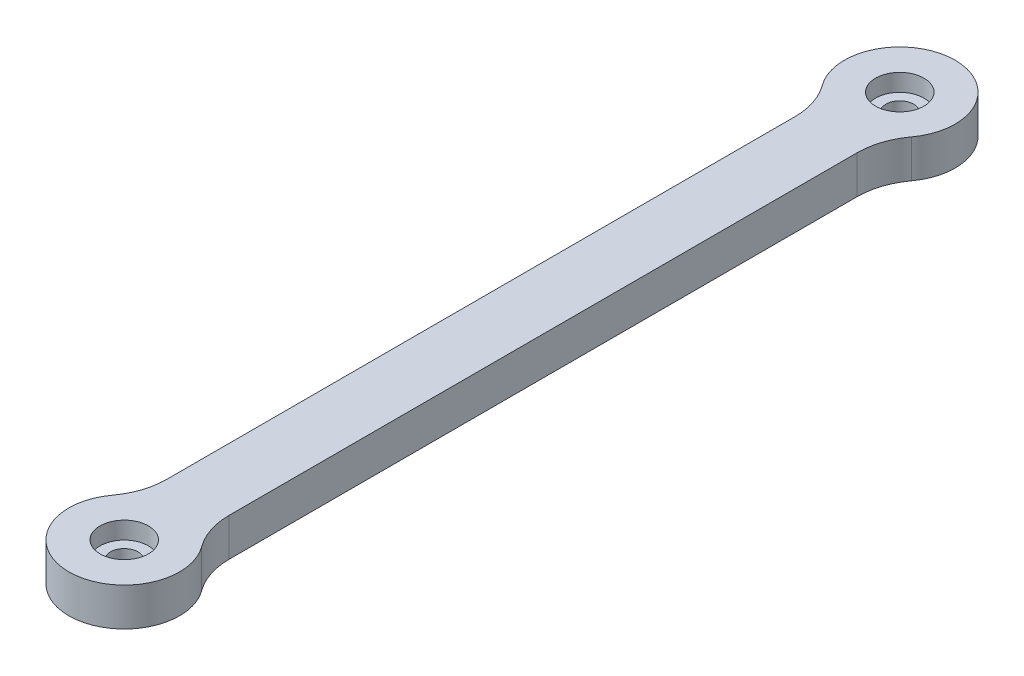
ISO-10303-21;
HEADER;
FILE_DESCRIPTION(('STEP AP214'),'2;1');
FILE_NAME('part.step','',(''),(''),'','','');
FILE_SCHEMA(('AUTOMOTIVE_DESIGN { 1 0 10303 214 1 1 1 1 }'));
ENDSEC;
DATA;
#1=APPLICATION_CONTEXT('core data for automotive mechanical design processes');
#2=APPLICATION_PROTOCOL_DEFINITION('international standard','automotive_design',2000,#1);
#3=PRODUCT_CONTEXT('',#1,'mechanical');
#4=PRODUCT('Part','Part','',(#3));
#5=PRODUCT_RELATED_PRODUCT_CATEGORY('part','',(#4));
#6=PRODUCT_DEFINITION_FORMATION('','',#4);
#7=PRODUCT_DEFINITION_CONTEXT('part definition',#1,'design');
#8=PRODUCT_DEFINITION('design','',#6,#7);
#9=PRODUCT_DEFINITION_SHAPE('','',#8);
#10=(LENGTH_UNIT() NAMED_UNIT(*) SI_UNIT(.MILLI.,.METRE.));
#11=(NAMED_UNIT(*) PLANE_ANGLE_UNIT() SI_UNIT($,.RADIAN.));
#12=(NAMED_UNIT(*) SI_UNIT($,.STERADIAN.) SOLID_ANGLE_UNIT());
#13=UNCERTAINTY_MEASURE_WITH_UNIT(LENGTH_MEASURE(1.E-05),#10,'distance_accuracy_value','');
#14=(GEOMETRIC_REPRESENTATION_CONTEXT(3) GLOBAL_UNCERTAINTY_ASSIGNED_CONTEXT((#13)) GLOBAL_UNIT_ASSIGNED_CONTEXT((#10,
#11,#12)) REPRESENTATION_CONTEXT('',''));
#15=CARTESIAN_POINT('',(0.,0.,0.));
#16=DIRECTION('',(0.,0.,1.));
#17=DIRECTION('',(1.,0.,0.));
#18=AXIS2_PLACEMENT_3D('',#15,#16,#17);
#19=CARTESIAN_POINT('',(0.,5.5,-56.));
#20=DIRECTION('',(0.,-1.,0.));
#21=DIRECTION('',(0.,0.,-1.));
#22=AXIS2_PLACEMENT_3D('',#19,#20,#21);
#23=CYLINDRICAL_SURFACE('',#22,2.);
#24=CARTESIAN_POINT('',(0.,0.,-56.));
#25=DIRECTION('',(0.,1.,0.));
#26=DIRECTION('',(0.,0.,1.));
#27=AXIS2_PLACEMENT_3D('',#24,#25,#26);
#28=CIRCLE('',#27,2.);
#29=CARTESIAN_POINT('',(0.,0.,-54.));
#30=VERTEX_POINT('',#29);
#31=EDGE_CURVE('E146',#30,#30,#28,.T.);
#32=ORIENTED_EDGE('',*,*,#31,.F.);
#33=EDGE_LOOP('',(#32));
#34=FACE_BOUND('',#33,.T.);
#35=CARTESIAN_POINT('',(0.,3.,-56.));
#36=DIRECTION('',(0.,1.,0.));
#37=DIRECTION('',(0.,0.,1.));
#38=AXIS2_PLACEMENT_3D('',#35,#36,#37);
#39=CIRCLE('',#38,2.);
#40=CARTESIAN_POINT('',(0.,3.,-54.));
#41=VERTEX_POINT('',#40);
#42=EDGE_CURVE('E226',#41,#41,#39,.T.);
#43=ORIENTED_EDGE('',*,*,#42,.T.);
#44=EDGE_LOOP('',(#43));
#45=FACE_BOUND('',#44,.T.);
#46=ADVANCED_FACE('F39',(#34,#45),#23,.F.);
#47=CARTESIAN_POINT('',(0.,5.5,56.));
#48=DIRECTION('',(0.,-1.,0.));
#49=DIRECTION('',(0.,0.,-1.));
#50=AXIS2_PLACEMENT_3D('',#47,#48,#49);
#51=CYLINDRICAL_SURFACE('',#50,2.);
#52=CARTESIAN_POINT('',(0.,0.,56.));
#53=DIRECTION('',(0.,1.,0.));
#54=DIRECTION('',(0.,0.,-1.));
#55=AXIS2_PLACEMENT_3D('',#52,#53,#54);
#56=CIRCLE('',#55,2.);
#57=CARTESIAN_POINT('',(0.,0.,54.));
#58=VERTEX_POINT('',#57);
#59=EDGE_CURVE('E212',#58,#58,#56,.T.);
#60=ORIENTED_EDGE('',*,*,#59,.F.);
#61=EDGE_LOOP('',(#60));
#62=FACE_BOUND('',#61,.T.);
#63=CARTESIAN_POINT('',(0.,3.,56.));
#64=DIRECTION('',(0.,1.,0.));
#65=DIRECTION('',(0.,0.,1.));
#66=AXIS2_PLACEMENT_3D('',#63,#64,#65);
#67=CIRCLE('',#66,2.);
#68=CARTESIAN_POINT('',(0.,3.,58.));
#69=VERTEX_POINT('',#68);
#70=EDGE_CURVE('E222',#69,#69,#67,.T.);
#71=ORIENTED_EDGE('',*,*,#70,.T.);
#72=EDGE_LOOP('',(#71));
#73=FACE_BOUND('',#72,.T.);
#74=ADVANCED_FACE('F257',(#62,#73),#51,.F.);
#75=CARTESIAN_POINT('',(14.5,5.5,-45.3346354961492));
#76=DIRECTION('',(0.,1.,0.));
#77=DIRECTION('',(0.,0.,1.));
#78=AXIS2_PLACEMENT_3D('',#75,#76,#77);
#79=PLANE('',#78);
#80=CARTESIAN_POINT('',(0.,5.5,-56.));
#81=DIRECTION('',(0.,1.,0.));
#82=DIRECTION('',(0.,0.,1.));
#83=AXIS2_PLACEMENT_3D('',#80,#81,#82);
#84=CIRCLE('',#83,3.5);
#85=CARTESIAN_POINT('',(0.,5.5,-52.5));
#86=VERTEX_POINT('',#85);
#87=EDGE_CURVE('E230',#86,#86,#84,.T.);
#88=ORIENTED_EDGE('',*,*,#87,.F.);
#89=EDGE_LOOP('',(#88));
#90=FACE_BOUND('',#89,.T.);
#91=CARTESIAN_POINT('',(0.,5.5,56.));
#92=DIRECTION('',(0.,1.,0.));
#93=DIRECTION('',(0.,0.,1.));
#94=AXIS2_PLACEMENT_3D('',#91,#92,#93);
#95=CIRCLE('',#94,3.5);
#96=CARTESIAN_POINT('',(0.,5.5,59.5));
#97=VERTEX_POINT('',#96);
#98=EDGE_CURVE('E217',#97,#97,#95,.T.);
#99=ORIENTED_EDGE('',*,*,#98,.F.);
#100=EDGE_LOOP('',(#99));
#101=FACE_BOUND('',#100,.T.);
#102=CARTESIAN_POINT('',(14.5,5.5,-45.3346354961492));
#103=DIRECTION('',(0.,-1.,0.));
#104=DIRECTION('',(0.,0.,1.));
#105=AXIS2_PLACEMENT_3D('',#102,#103,#104);
#106=CIRCLE('',#105,10.);
#107=CARTESIAN_POINT('',(4.5,5.5,-45.3346354961492));
#108=VERTEX_POINT('',#107);
#109=CARTESIAN_POINT('',(6.44444444444444,5.5,-51.2598379982886));
#110=VERTEX_POINT('',#109);
#111=EDGE_CURVE('E164',#108,#110,#106,.T.);
#112=ORIENTED_EDGE('',*,*,#111,.T.);
#113=CARTESIAN_POINT('',(0.,5.5,-56.));
#114=DIRECTION('',(0.,1.,0.));
#115=DIRECTION('',(0.,0.,1.));
#116=AXIS2_PLACEMENT_3D('',#113,#114,#115);
#117=CIRCLE('',#116,8.);
#118=CARTESIAN_POINT('',(-6.44444444444444,5.5,-51.2598379982886));
#119=VERTEX_POINT('',#118);
#120=EDGE_CURVE('E100',#110,#119,#117,.T.);
#121=ORIENTED_EDGE('',*,*,#120,.T.);
#122=CARTESIAN_POINT('',(-14.5,5.5,-45.3346354961492));
#123=DIRECTION('',(0.,-1.,0.));
#124=DIRECTION('',(0.,0.,1.));
#125=AXIS2_PLACEMENT_3D('',#122,#123,#124);
#126=CIRCLE('',#125,10.);
#127=CARTESIAN_POINT('',(-4.5,5.5,-45.3346354961492));
#128=VERTEX_POINT('',#127);
#129=EDGE_CURVE('E185',#119,#128,#126,.T.);
#130=ORIENTED_EDGE('',*,*,#129,.T.);
#131=DIRECTION('',(0.,0.,1.));
#132=VECTOR('',#131,1.);
#133=CARTESIAN_POINT('',(-4.5,5.5,-45.3346354961492));
#134=LINE('',#133,#132);
#135=CARTESIAN_POINT('',(-4.5,5.5,45.3346354961492));
#136=VERTEX_POINT('',#135);
#137=EDGE_CURVE('E199',#128,#136,#134,.T.);
#138=ORIENTED_EDGE('',*,*,#137,.T.);
#139=CARTESIAN_POINT('',(-14.5,5.5,45.3346354961492));
#140=DIRECTION('',(0.,-1.,0.));
#141=DIRECTION('',(0.,0.,-1.));
#142=AXIS2_PLACEMENT_3D('',#139,#140,#141);
#143=CIRCLE('',#142,10.);
#144=CARTESIAN_POINT('',(-6.44444444444444,5.5,51.2598379982886));
#145=VERTEX_POINT('',#144);
#146=EDGE_CURVE('E119',#136,#145,#143,.T.);
#147=ORIENTED_EDGE('',*,*,#146,.T.);
#148=CARTESIAN_POINT('',(0.,5.5,56.));
#149=DIRECTION('',(0.,1.,0.));
#150=DIRECTION('',(0.,0.,-1.));
#151=AXIS2_PLACEMENT_3D('',#148,#149,#150);
#152=CIRCLE('',#151,8.);
#153=CARTESIAN_POINT('',(6.44444444444444,5.5,51.2598379982886));
#154=VERTEX_POINT('',#153);
#155=EDGE_CURVE('E113',#145,#154,#152,.T.);
#156=ORIENTED_EDGE('',*,*,#155,.T.);
#157=CARTESIAN_POINT('',(14.5,5.5,45.3346354961492));
#158=DIRECTION('',(0.,-1.,0.));
#159=DIRECTION('',(0.,0.,-1.));
#160=AXIS2_PLACEMENT_3D('',#157,#158,#159);
#161=CIRCLE('',#160,10.);
#162=CARTESIAN_POINT('',(4.5,5.5,45.3346354961492));
#163=VERTEX_POINT('',#162);
#164=EDGE_CURVE('E117',#154,#163,#161,.T.);
#165=ORIENTED_EDGE('',*,*,#164,.T.);
#166=DIRECTION('',(0.,0.,-1.));
#167=VECTOR('',#166,1.);
#168=CARTESIAN_POINT('',(4.5,5.5,-45.3346354961492));
#169=LINE('',#168,#167);
#170=EDGE_CURVE('E57',#163,#108,#169,.T.);
#171=ORIENTED_EDGE('',*,*,#170,.T.);
#172=EDGE_LOOP('',(#112,#121,#130,#138,#147,#156,#165,#171));
#173=FACE_BOUND('',#172,.T.);
#174=ADVANCED_FACE('F115',(#90,#101,#173),#79,.T.);
#175=CARTESIAN_POINT('',(14.5,0.,-45.3346354961492));
#176=DIRECTION('',(0.,1.,0.));
#177=DIRECTION('',(0.,0.,1.));
#178=AXIS2_PLACEMENT_3D('',#175,#176,#177);
#179=PLANE('',#178);
#180=CARTESIAN_POINT('',(14.5,0.,-45.3346354961492));
#181=DIRECTION('',(0.,-1.,0.));
#182=DIRECTION('',(0.,0.,1.));
#183=AXIS2_PLACEMENT_3D('',#180,#181,#182);
#184=CIRCLE('',#183,10.);
#185=CARTESIAN_POINT('',(4.5,0.,-45.3346354961492));
#186=VERTEX_POINT('',#185);
#187=CARTESIAN_POINT('',(6.44444444444444,0.,-51.2598379982886));
#188=VERTEX_POINT('',#187);
#189=EDGE_CURVE('E141',#186,#188,#184,.T.);
#190=ORIENTED_EDGE('',*,*,#189,.F.);
#191=DIRECTION('',(0.,0.,-1.));
#192=VECTOR('',#191,1.);
#193=CARTESIAN_POINT('',(4.5,0.,-45.3346354961492));
#194=LINE('',#193,#192);
#195=CARTESIAN_POINT('',(4.5,0.,45.3346354961492));
#196=VERTEX_POINT('',#195);
#197=EDGE_CURVE('E92',#196,#186,#194,.T.);
#198=ORIENTED_EDGE('',*,*,#197,.F.);
#199=CARTESIAN_POINT('',(14.5,0.,45.3346354961492));
#200=DIRECTION('',(0.,-1.,0.));
#201=DIRECTION('',(0.,0.,-1.));
#202=AXIS2_PLACEMENT_3D('',#199,#200,#201);
#203=CIRCLE('',#202,10.);
#204=CARTESIAN_POINT('',(6.44444444444444,0.,51.2598379982886));
#205=VERTEX_POINT('',#204);
#206=EDGE_CURVE('E86',#205,#196,#203,.T.);
#207=ORIENTED_EDGE('',*,*,#206,.F.);
#208=CARTESIAN_POINT('',(0.,0.,56.));
#209=DIRECTION('',(0.,1.,0.));
#210=DIRECTION('',(0.,0.,-1.));
#211=AXIS2_PLACEMENT_3D('',#208,#209,#210);
#212=CIRCLE('',#211,8.);
#213=CARTESIAN_POINT('',(-6.44444444444444,0.,51.2598379982886));
#214=VERTEX_POINT('',#213);
#215=EDGE_CURVE('E128',#214,#205,#212,.T.);
#216=ORIENTED_EDGE('',*,*,#215,.F.);
#217=CARTESIAN_POINT('',(-14.5,0.,45.3346354961492));
#218=DIRECTION('',(0.,-1.,0.));
#219=DIRECTION('',(0.,0.,-1.));
#220=AXIS2_PLACEMENT_3D('',#217,#218,#219);
#221=CIRCLE('',#220,10.);
#222=CARTESIAN_POINT('',(-4.5,0.,45.3346354961492));
#223=VERTEX_POINT('',#222);
#224=EDGE_CURVE('E155',#223,#214,#221,.T.);
#225=ORIENTED_EDGE('',*,*,#224,.F.);
#226=DIRECTION('',(0.,0.,1.));
#227=VECTOR('',#226,1.);
#228=CARTESIAN_POINT('',(-4.5,0.,-45.3346354961492));
#229=LINE('',#228,#227);
#230=CARTESIAN_POINT('',(-4.5,0.,-45.3346354961492));
#231=VERTEX_POINT('',#230);
#232=EDGE_CURVE('E152',#231,#223,#229,.T.);
#233=ORIENTED_EDGE('',*,*,#232,.F.);
#234=CARTESIAN_POINT('',(-14.5,0.,-45.3346354961492));
#235=DIRECTION('',(0.,-1.,0.));
#236=DIRECTION('',(0.,0.,1.));
#237=AXIS2_PLACEMENT_3D('',#234,#235,#236);
#238=CIRCLE('',#237,10.);
#239=CARTESIAN_POINT('',(-6.44444444444444,0.,-51.2598379982886));
#240=VERTEX_POINT('',#239);
#241=EDGE_CURVE('E149',#240,#231,#238,.T.);
#242=ORIENTED_EDGE('',*,*,#241,.F.);
#243=CARTESIAN_POINT('',(0.,0.,-56.));
#244=DIRECTION('',(0.,1.,0.));
#245=DIRECTION('',(0.,0.,1.));
#246=AXIS2_PLACEMENT_3D('',#243,#244,#245);
#247=CIRCLE('',#246,8.);
#248=EDGE_CURVE('E145',#188,#240,#247,.T.);
#249=ORIENTED_EDGE('',*,*,#248,.F.);
#250=EDGE_LOOP('',(#190,#198,#207,#216,#225,#233,#242,#249));
#251=FACE_BOUND('',#250,.T.);
#252=ORIENTED_EDGE('',*,*,#31,.T.);
#253=EDGE_LOOP('',(#252));
#254=FACE_BOUND('',#253,.T.);
#255=ORIENTED_EDGE('',*,*,#59,.T.);
#256=EDGE_LOOP('',(#255));
#257=FACE_BOUND('',#256,.T.);
#258=ADVANCED_FACE('F189',(#251,#254,#257),#179,.F.);
#259=CARTESIAN_POINT('',(14.5,5.5,-45.3346354961492));
#260=DIRECTION('',(0.,-1.,0.));
#261=DIRECTION('',(0.,0.,-1.));
#262=AXIS2_PLACEMENT_3D('',#259,#260,#261);
#263=CYLINDRICAL_SURFACE('',#262,10.);
#264=ORIENTED_EDGE('',*,*,#189,.T.);
#265=DIRECTION('',(0.,-1.,0.));
#266=VECTOR('',#265,1.);
#267=CARTESIAN_POINT('',(6.44444444444444,5.5,-51.2598379982886));
#268=LINE('',#267,#266);
#269=EDGE_CURVE('E11',#110,#188,#268,.T.);
#270=ORIENTED_EDGE('',*,*,#269,.F.);
#271=ORIENTED_EDGE('',*,*,#111,.F.);
#272=DIRECTION('',(0.,-1.,0.));
#273=VECTOR('',#272,1.);
#274=CARTESIAN_POINT('',(4.5,5.5,-45.3346354961492));
#275=LINE('',#274,#273);
#276=EDGE_CURVE('E137',#108,#186,#275,.T.);
#277=ORIENTED_EDGE('',*,*,#276,.T.);
#278=EDGE_LOOP('',(#264,#270,#271,#277));
#279=FACE_BOUND('',#278,.T.);
#280=ADVANCED_FACE('F41',(#279),#263,.F.);
#281=CARTESIAN_POINT('',(0.,5.5,-56.));
#282=DIRECTION('',(0.,-1.,0.));
#283=DIRECTION('',(0.,0.,-1.));
#284=AXIS2_PLACEMENT_3D('',#281,#282,#283);
#285=CYLINDRICAL_SURFACE('',#284,8.);
#286=ORIENTED_EDGE('',*,*,#248,.T.);
#287=DIRECTION('',(0.,-1.,0.));
#288=VECTOR('',#287,1.);
#289=CARTESIAN_POINT('',(-6.44444444444444,5.5,-51.2598379982886));
#290=LINE('',#289,#288);
#291=EDGE_CURVE('E49',#119,#240,#290,.T.);
#292=ORIENTED_EDGE('',*,*,#291,.F.);
#293=ORIENTED_EDGE('',*,*,#120,.F.);
#294=ORIENTED_EDGE('',*,*,#269,.T.);
#295=EDGE_LOOP('',(#286,#292,#293,#294));
#296=FACE_BOUND('',#295,.T.);
#297=ADVANCED_FACE('F295',(#296),#285,.T.);
#298=CARTESIAN_POINT('',(-14.5,5.5,-45.3346354961492));
#299=DIRECTION('',(0.,-1.,0.));
#300=DIRECTION('',(0.,0.,-1.));
#301=AXIS2_PLACEMENT_3D('',#298,#299,#300);
#302=CYLINDRICAL_SURFACE('',#301,10.);
#303=ORIENTED_EDGE('',*,*,#241,.T.);
#304=DIRECTION('',(0.,-1.,0.));
#305=VECTOR('',#304,1.);
#306=CARTESIAN_POINT('',(-4.5,5.5,-45.3346354961492));
#307=LINE('',#306,#305);
#308=EDGE_CURVE('E175',#128,#231,#307,.T.);
#309=ORIENTED_EDGE('',*,*,#308,.F.);
#310=ORIENTED_EDGE('',*,*,#129,.F.);
#311=ORIENTED_EDGE('',*,*,#291,.T.);
#312=EDGE_LOOP('',(#303,#309,#310,#311));
#313=FACE_BOUND('',#312,.T.);
#314=ADVANCED_FACE('F183',(#313),#302,.F.);
#315=CARTESIAN_POINT('',(-4.5,5.5,-45.3346354961492));
#316=DIRECTION('',(1.,0.,0.));
#317=DIRECTION('',(0.,0.,-1.));
#318=AXIS2_PLACEMENT_3D('',#315,#316,#317);
#319=PLANE('',#318);
#320=ORIENTED_EDGE('',*,*,#232,.T.);
#321=DIRECTION('',(0.,-1.,0.));
#322=VECTOR('',#321,1.);
#323=CARTESIAN_POINT('',(-4.5,5.5,45.3346354961492));
#324=LINE('',#323,#322);
#325=EDGE_CURVE('E171',#136,#223,#324,.T.);
#326=ORIENTED_EDGE('',*,*,#325,.F.);
#327=ORIENTED_EDGE('',*,*,#137,.F.);
#328=ORIENTED_EDGE('',*,*,#308,.T.);
#329=EDGE_LOOP('',(#320,#326,#327,#328));
#330=FACE_BOUND('',#329,.T.);
#331=ADVANCED_FACE('F194',(#330),#319,.F.);
#332=CARTESIAN_POINT('',(-14.5,5.5,45.3346354961492));
#333=DIRECTION('',(0.,-1.,0.));
#334=DIRECTION('',(0.,0.,-1.));
#335=AXIS2_PLACEMENT_3D('',#332,#333,#334);
#336=CYLINDRICAL_SURFACE('',#335,10.);
#337=ORIENTED_EDGE('',*,*,#224,.T.);
#338=DIRECTION('',(0.,-1.,0.));
#339=VECTOR('',#338,1.);
#340=CARTESIAN_POINT('',(-6.44444444444444,5.5,51.2598379982886));
#341=LINE('',#340,#339);
#342=EDGE_CURVE('E130',#145,#214,#341,.T.);
#343=ORIENTED_EDGE('',*,*,#342,.F.);
#344=ORIENTED_EDGE('',*,*,#146,.F.);
#345=ORIENTED_EDGE('',*,*,#325,.T.);
#346=EDGE_LOOP('',(#337,#343,#344,#345));
#347=FACE_BOUND('',#346,.T.);
#348=ADVANCED_FACE('F197',(#347),#336,.F.);
#349=CARTESIAN_POINT('',(0.,5.5,56.));
#350=DIRECTION('',(0.,-1.,0.));
#351=DIRECTION('',(0.,0.,-1.));
#352=AXIS2_PLACEMENT_3D('',#349,#350,#351);
#353=CYLINDRICAL_SURFACE('',#352,8.);
#354=ORIENTED_EDGE('',*,*,#215,.T.);
#355=DIRECTION('',(0.,-1.,0.));
#356=VECTOR('',#355,1.);
#357=CARTESIAN_POINT('',(6.44444444444444,5.5,51.2598379982886));
#358=LINE('',#357,#356);
#359=EDGE_CURVE('E125',#154,#205,#358,.T.);
#360=ORIENTED_EDGE('',*,*,#359,.F.);
#361=ORIENTED_EDGE('',*,*,#155,.F.);
#362=ORIENTED_EDGE('',*,*,#342,.T.);
#363=EDGE_LOOP('',(#354,#360,#361,#362));
#364=FACE_BOUND('',#363,.T.);
#365=ADVANCED_FACE('F126',(#364),#353,.T.);
#366=CARTESIAN_POINT('',(14.5,5.5,45.3346354961492));
#367=DIRECTION('',(0.,-1.,0.));
#368=DIRECTION('',(0.,0.,-1.));
#369=AXIS2_PLACEMENT_3D('',#366,#367,#368);
#370=CYLINDRICAL_SURFACE('',#369,10.);
#371=ORIENTED_EDGE('',*,*,#206,.T.);
#372=DIRECTION('',(0.,-1.,0.));
#373=VECTOR('',#372,1.);
#374=CARTESIAN_POINT('',(4.5,5.5,45.3346354961492));
#375=LINE('',#374,#373);
#376=EDGE_CURVE('E131',#163,#196,#375,.T.);
#377=ORIENTED_EDGE('',*,*,#376,.F.);
#378=ORIENTED_EDGE('',*,*,#164,.F.);
#379=ORIENTED_EDGE('',*,*,#359,.T.);
#380=EDGE_LOOP('',(#371,#377,#378,#379));
#381=FACE_BOUND('',#380,.T.);
#382=ADVANCED_FACE('F133',(#381),#370,.F.);
#383=CARTESIAN_POINT('',(4.5,5.5,-45.3346354961492));
#384=DIRECTION('',(-1.,0.,0.));
#385=DIRECTION('',(0.,0.,1.));
#386=AXIS2_PLACEMENT_3D('',#383,#384,#385);
#387=PLANE('',#386);
#388=ORIENTED_EDGE('',*,*,#197,.T.);
#389=ORIENTED_EDGE('',*,*,#276,.F.);
#390=ORIENTED_EDGE('',*,*,#170,.F.);
#391=ORIENTED_EDGE('',*,*,#376,.T.);
#392=EDGE_LOOP('',(#388,#389,#390,#391));
#393=FACE_BOUND('',#392,.T.);
#394=ADVANCED_FACE('F263',(#393),#387,.F.);
#395=CARTESIAN_POINT('',(0.,3.,56.));
#396=DIRECTION('',(0.,1.,0.));
#397=DIRECTION('',(0.,0.,1.));
#398=AXIS2_PLACEMENT_3D('',#395,#396,#397);
#399=CYLINDRICAL_SURFACE('',#398,3.5);
#400=CARTESIAN_POINT('',(0.,3.,56.));
#401=DIRECTION('',(0.,1.,0.));
#402=DIRECTION('',(0.,0.,1.));
#403=AXIS2_PLACEMENT_3D('',#400,#401,#402);
#404=CIRCLE('',#403,3.5);
#405=CARTESIAN_POINT('',(0.,3.,59.5));
#406=VERTEX_POINT('',#405);
#407=EDGE_CURVE('E221',#406,#406,#404,.T.);
#408=ORIENTED_EDGE('',*,*,#407,.F.);
#409=EDGE_LOOP('',(#408));
#410=FACE_BOUND('',#409,.T.);
#411=ORIENTED_EDGE('',*,*,#98,.T.);
#412=EDGE_LOOP('',(#411));
#413=FACE_BOUND('',#412,.T.);
#414=ADVANCED_FACE('F261',(#410,#413),#399,.F.);
#415=CARTESIAN_POINT('',(0.,3.,56.));
#416=DIRECTION('',(0.,1.,0.));
#417=DIRECTION('',(0.,0.,1.));
#418=AXIS2_PLACEMENT_3D('',#415,#416,#417);
#419=PLANE('',#418);
#420=ORIENTED_EDGE('',*,*,#70,.F.);
#421=EDGE_LOOP('',(#420));
#422=FACE_BOUND('',#421,.T.);
#423=ORIENTED_EDGE('',*,*,#407,.T.);
#424=EDGE_LOOP('',(#423));
#425=FACE_BOUND('',#424,.T.);
#426=ADVANCED_FACE('F251',(#422,#425),#419,.T.);
#427=CARTESIAN_POINT('',(0.,3.,-56.));
#428=DIRECTION('',(0.,1.,0.));
#429=DIRECTION('',(0.,0.,1.));
#430=AXIS2_PLACEMENT_3D('',#427,#428,#429);
#431=CYLINDRICAL_SURFACE('',#430,3.5);
#432=CARTESIAN_POINT('',(0.,3.,-56.));
#433=DIRECTION('',(0.,1.,0.));
#434=DIRECTION('',(0.,0.,1.));
#435=AXIS2_PLACEMENT_3D('',#432,#433,#434);
#436=CIRCLE('',#435,3.5);
#437=CARTESIAN_POINT('',(0.,3.,-52.5));
#438=VERTEX_POINT('',#437);
#439=EDGE_CURVE('E216',#438,#438,#436,.T.);
#440=ORIENTED_EDGE('',*,*,#439,.F.);
#441=EDGE_LOOP('',(#440));
#442=FACE_BOUND('',#441,.T.);
#443=ORIENTED_EDGE('',*,*,#87,.T.);
#444=EDGE_LOOP('',(#443));
#445=FACE_BOUND('',#444,.T.);
#446=ADVANCED_FACE('F245',(#442,#445),#431,.F.);
#447=CARTESIAN_POINT('',(0.,3.,-56.));
#448=DIRECTION('',(0.,1.,0.));
#449=DIRECTION('',(0.,0.,1.));
#450=AXIS2_PLACEMENT_3D('',#447,#448,#449);
#451=PLANE('',#450);
#452=ORIENTED_EDGE('',*,*,#42,.F.);
#453=EDGE_LOOP('',(#452));
#454=FACE_BOUND('',#453,.T.);
#455=ORIENTED_EDGE('',*,*,#439,.T.);
#456=EDGE_LOOP('',(#455));
#457=FACE_BOUND('',#456,.T.);
#458=ADVANCED_FACE('F242',(#454,#457),#451,.T.);
#459=CLOSED_SHELL('',(#46,#74,#174,#258,#280,#297,#314,#331,#348,#365,#382,#394,#414,#426,#446,#458));
#460=MANIFOLD_SOLID_BREP('B2',#459);
#461=ADVANCED_BREP_SHAPE_REPRESENTATION('',(#18,#460),#14);
#462=SHAPE_DEFINITION_REPRESENTATION(#9,#461);
ENDSEC;
END-ISO-10303-21;
